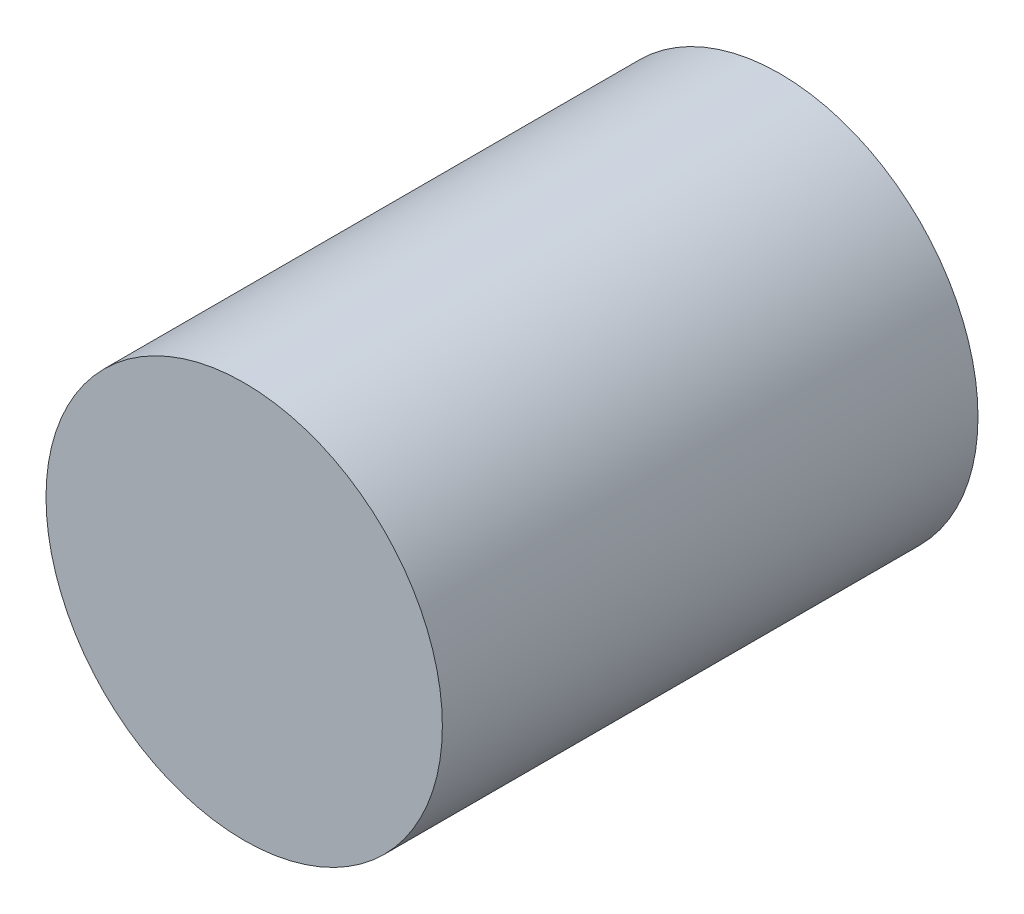
ISO-10303-21;
HEADER;
FILE_DESCRIPTION(('STEP AP214'),'2;1');
FILE_NAME('part.step','',(''),(''),'','','');
FILE_SCHEMA(('AUTOMOTIVE_DESIGN { 1 0 10303 214 1 1 1 1 }'));
ENDSEC;
DATA;
#1=APPLICATION_CONTEXT('core data for automotive mechanical design processes');
#2=APPLICATION_PROTOCOL_DEFINITION('international standard','automotive_design',2000,#1);
#3=PRODUCT_CONTEXT('',#1,'mechanical');
#4=PRODUCT('Part','Part','',(#3));
#5=PRODUCT_RELATED_PRODUCT_CATEGORY('part','',(#4));
#6=PRODUCT_DEFINITION_FORMATION('','',#4);
#7=PRODUCT_DEFINITION_CONTEXT('part definition',#1,'design');
#8=PRODUCT_DEFINITION('design','',#6,#7);
#9=PRODUCT_DEFINITION_SHAPE('','',#8);
#10=(LENGTH_UNIT() NAMED_UNIT(*) SI_UNIT(.MILLI.,.METRE.));
#11=(NAMED_UNIT(*) PLANE_ANGLE_UNIT() SI_UNIT($,.RADIAN.));
#12=(NAMED_UNIT(*) SI_UNIT($,.STERADIAN.) SOLID_ANGLE_UNIT());
#13=UNCERTAINTY_MEASURE_WITH_UNIT(LENGTH_MEASURE(1.E-05),#10,'distance_accuracy_value','');
#14=(GEOMETRIC_REPRESENTATION_CONTEXT(3) GLOBAL_UNCERTAINTY_ASSIGNED_CONTEXT((#13)) GLOBAL_UNIT_ASSIGNED_CONTEXT((#10,
#11,#12)) REPRESENTATION_CONTEXT('',''));
#15=CARTESIAN_POINT('',(0.,0.,0.));
#16=DIRECTION('',(0.,0.,1.));
#17=DIRECTION('',(1.,0.,0.));
#18=AXIS2_PLACEMENT_3D('',#15,#16,#17);
#19=CARTESIAN_POINT('',(0.,0.,12.7));
#20=DIRECTION('',(0.,0.,-1.));
#21=DIRECTION('',(-0.999999999999998,0.,0.));
#22=AXIS2_PLACEMENT_3D('',#19,#20,#21);
#23=CYLINDRICAL_SURFACE('',#22,4.699);
#24=CARTESIAN_POINT('',(0.,0.,12.7));
#25=DIRECTION('',(0.,0.,1.));
#26=DIRECTION('',(0.999999999999998,0.,0.));
#27=AXIS2_PLACEMENT_3D('',#24,#25,#26);
#28=CIRCLE('',#27,4.699);
#29=CARTESIAN_POINT('',(4.69899999999999,0.,12.7));
#30=VERTEX_POINT('',#29);
#31=EDGE_CURVE('E10',#30,#30,#28,.T.);
#32=ORIENTED_EDGE('',*,*,#31,.F.);
#33=EDGE_LOOP('',(#32));
#34=FACE_BOUND('',#33,.T.);
#35=CARTESIAN_POINT('',(0.,0.,0.));
#36=DIRECTION('',(0.,0.,1.));
#37=DIRECTION('',(0.999999999999998,0.,0.));
#38=AXIS2_PLACEMENT_3D('',#35,#36,#37);
#39=CIRCLE('',#38,4.699);
#40=CARTESIAN_POINT('',(4.69899999999999,0.,0.));
#41=VERTEX_POINT('',#40);
#42=EDGE_CURVE('E33',#41,#41,#39,.T.);
#43=ORIENTED_EDGE('',*,*,#42,.T.);
#44=EDGE_LOOP('',(#43));
#45=FACE_BOUND('',#44,.T.);
#46=ADVANCED_FACE('F30',(#34,#45),#23,.T.);
#47=CARTESIAN_POINT('',(0.,0.,12.7));
#48=DIRECTION('',(0.,0.,1.));
#49=DIRECTION('',(0.999999999999998,0.,0.));
#50=AXIS2_PLACEMENT_3D('',#47,#48,#49);
#51=PLANE('',#50);
#52=ORIENTED_EDGE('',*,*,#31,.T.);
#53=EDGE_LOOP('',(#52));
#54=FACE_BOUND('',#53,.T.);
#55=ADVANCED_FACE('F45',(#54),#51,.T.);
#56=CARTESIAN_POINT('',(0.,0.,0.));
#57=DIRECTION('',(0.,0.,1.));
#58=DIRECTION('',(0.999999999999998,0.,0.));
#59=AXIS2_PLACEMENT_3D('',#56,#57,#58);
#60=PLANE('',#59);
#61=ORIENTED_EDGE('',*,*,#42,.F.);
#62=EDGE_LOOP('',(#61));
#63=FACE_BOUND('',#62,.T.);
#64=ADVANCED_FACE('F43',(#63),#60,.F.);
#65=CLOSED_SHELL('',(#46,#55,#64));
#66=MANIFOLD_SOLID_BREP('B2',#65);
#67=ADVANCED_BREP_SHAPE_REPRESENTATION('',(#18,#66),#14);
#68=SHAPE_DEFINITION_REPRESENTATION(#9,#67);
ENDSEC;
END-ISO-10303-21;
